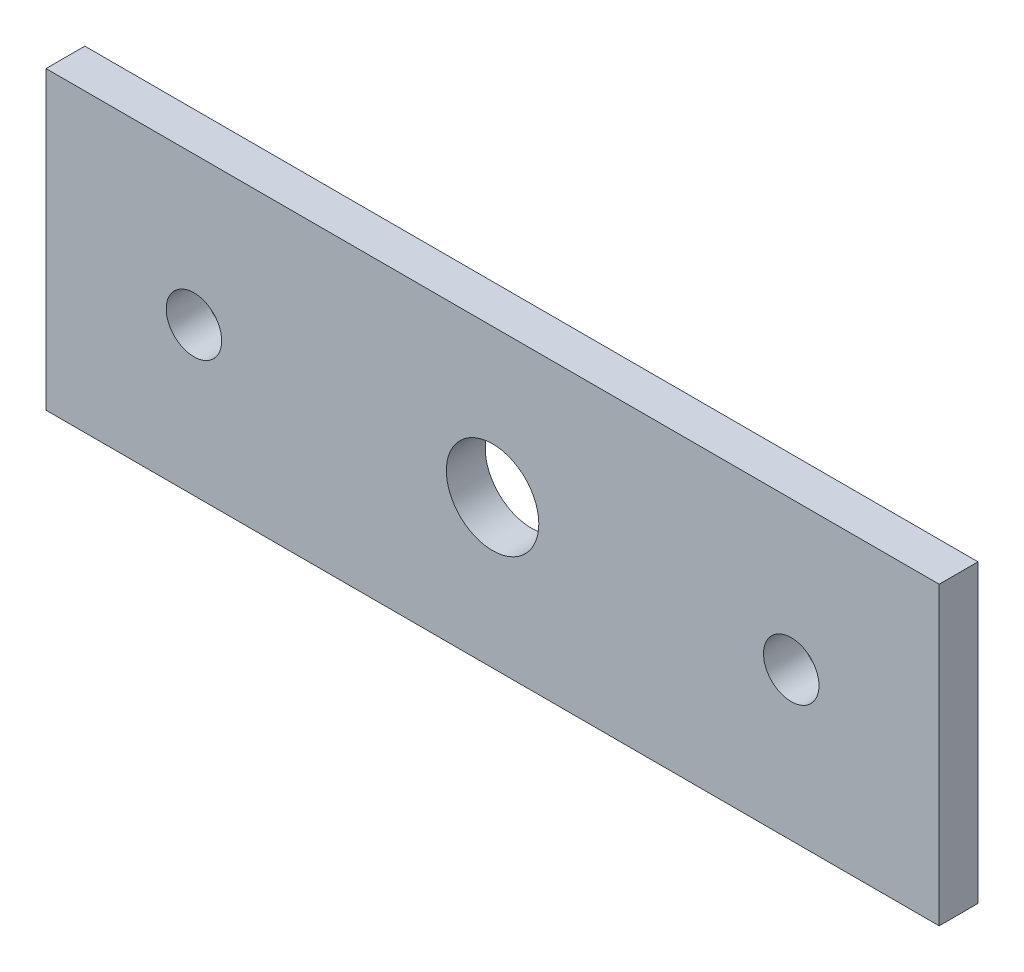
ISO-10303-21;
HEADER;
FILE_DESCRIPTION(('STEP AP214'),'2;1');
FILE_NAME('part.step','',(''),(''),'','','');
FILE_SCHEMA(('AUTOMOTIVE_DESIGN { 1 0 10303 214 1 1 1 1 }'));
ENDSEC;
DATA;
#1=APPLICATION_CONTEXT('core data for automotive mechanical design processes');
#2=APPLICATION_PROTOCOL_DEFINITION('international standard','automotive_design',2000,#1);
#3=PRODUCT_CONTEXT('',#1,'mechanical');
#4=PRODUCT('Part','Part','',(#3));
#5=PRODUCT_RELATED_PRODUCT_CATEGORY('part','',(#4));
#6=PRODUCT_DEFINITION_FORMATION('','',#4);
#7=PRODUCT_DEFINITION_CONTEXT('part definition',#1,'design');
#8=PRODUCT_DEFINITION('design','',#6,#7);
#9=PRODUCT_DEFINITION_SHAPE('','',#8);
#10=(LENGTH_UNIT() NAMED_UNIT(*) SI_UNIT(.MILLI.,.METRE.));
#11=(NAMED_UNIT(*) PLANE_ANGLE_UNIT() SI_UNIT($,.RADIAN.));
#12=(NAMED_UNIT(*) SI_UNIT($,.STERADIAN.) SOLID_ANGLE_UNIT());
#13=UNCERTAINTY_MEASURE_WITH_UNIT(LENGTH_MEASURE(1.E-05),#10,'distance_accuracy_value','');
#14=(GEOMETRIC_REPRESENTATION_CONTEXT(3) GLOBAL_UNCERTAINTY_ASSIGNED_CONTEXT((#13)) GLOBAL_UNIT_ASSIGNED_CONTEXT((#10,
#11,#12)) REPRESENTATION_CONTEXT('',''));
#15=CARTESIAN_POINT('',(0.,0.,0.));
#16=DIRECTION('',(0.,0.,1.));
#17=DIRECTION('',(1.,0.,0.));
#18=AXIS2_PLACEMENT_3D('',#15,#16,#17);
#19=CARTESIAN_POINT('',(-19.8824614450658,16.6713286713287,4.2));
#20=DIRECTION('',(1.,0.,0.));
#21=DIRECTION('',(0.,0.,-1.));
#22=AXIS2_PLACEMENT_3D('',#19,#20,#21);
#23=PLANE('',#22);
#24=DIRECTION('',(0.,-1.,0.));
#25=VECTOR('',#24,1.);
#26=CARTESIAN_POINT('',(-19.8824614450658,16.6713286713287,0.));
#27=LINE('',#26,#25);
#28=CARTESIAN_POINT('',(-19.8824614450658,16.6713286713287,0.));
#29=VERTEX_POINT('',#28);
#30=CARTESIAN_POINT('',(-19.8824614450658,-15.3286713286713,0.));
#31=VERTEX_POINT('',#30);
#32=EDGE_CURVE('E96',#29,#31,#27,.T.);
#33=ORIENTED_EDGE('',*,*,#32,.T.);
#34=DIRECTION('',(0.,0.,-1.));
#35=VECTOR('',#34,1.);
#36=CARTESIAN_POINT('',(-19.8824614450658,-15.3286713286713,4.2));
#37=LINE('',#36,#35);
#38=CARTESIAN_POINT('',(-19.8824614450658,-15.3286713286713,4.2));
#39=VERTEX_POINT('',#38);
#40=EDGE_CURVE('E11',#39,#31,#37,.T.);
#41=ORIENTED_EDGE('',*,*,#40,.F.);
#42=DIRECTION('',(0.,-1.,0.));
#43=VECTOR('',#42,1.);
#44=CARTESIAN_POINT('',(-19.8824614450658,16.6713286713287,4.2));
#45=LINE('',#44,#43);
#46=CARTESIAN_POINT('',(-19.8824614450658,16.6713286713287,4.2));
#47=VERTEX_POINT('',#46);
#48=EDGE_CURVE('E84',#47,#39,#45,.T.);
#49=ORIENTED_EDGE('',*,*,#48,.F.);
#50=DIRECTION('',(0.,0.,-1.));
#51=VECTOR('',#50,1.);
#52=CARTESIAN_POINT('',(-19.8824614450658,16.6713286713287,4.2));
#53=LINE('',#52,#51);
#54=EDGE_CURVE('E92',#47,#29,#53,.T.);
#55=ORIENTED_EDGE('',*,*,#54,.T.);
#56=EDGE_LOOP('',(#33,#41,#49,#55));
#57=FACE_BOUND('',#56,.T.);
#58=ADVANCED_FACE('F33',(#57),#23,.F.);
#59=CARTESIAN_POINT('',(-19.8824614450658,-15.3286713286713,4.2));
#60=DIRECTION('',(0.,1.,0.));
#61=DIRECTION('',(-1.,0.,0.));
#62=AXIS2_PLACEMENT_3D('',#59,#60,#61);
#63=PLANE('',#62);
#64=DIRECTION('',(1.,0.,0.));
#65=VECTOR('',#64,1.);
#66=CARTESIAN_POINT('',(-19.8824614450658,-15.3286713286713,0.));
#67=LINE('',#66,#65);
#68=CARTESIAN_POINT('',(76.7175385549342,-15.3286713286713,0.));
#69=VERTEX_POINT('',#68);
#70=EDGE_CURVE('E88',#31,#69,#67,.T.);
#71=ORIENTED_EDGE('',*,*,#70,.T.);
#72=DIRECTION('',(0.,0.,-1.));
#73=VECTOR('',#72,1.);
#74=CARTESIAN_POINT('',(76.7175385549342,-15.3286713286713,4.2));
#75=LINE('',#74,#73);
#76=CARTESIAN_POINT('',(76.7175385549342,-15.3286713286713,4.2));
#77=VERTEX_POINT('',#76);
#78=EDGE_CURVE('E41',#77,#69,#75,.T.);
#79=ORIENTED_EDGE('',*,*,#78,.F.);
#80=DIRECTION('',(1.,0.,0.));
#81=VECTOR('',#80,1.);
#82=CARTESIAN_POINT('',(-19.8824614450658,-15.3286713286713,4.2));
#83=LINE('',#82,#81);
#84=EDGE_CURVE('E79',#39,#77,#83,.T.);
#85=ORIENTED_EDGE('',*,*,#84,.F.);
#86=ORIENTED_EDGE('',*,*,#40,.T.);
#87=EDGE_LOOP('',(#71,#79,#85,#86));
#88=FACE_BOUND('',#87,.T.);
#89=ADVANCED_FACE('F87',(#88),#63,.F.);
#90=CARTESIAN_POINT('',(76.7175385549342,16.6713286713287,4.2));
#91=DIRECTION('',(-1.,0.,0.));
#92=DIRECTION('',(0.,0.,1.));
#93=AXIS2_PLACEMENT_3D('',#90,#91,#92);
#94=PLANE('',#93);
#95=DIRECTION('',(0.,1.,0.));
#96=VECTOR('',#95,1.);
#97=CARTESIAN_POINT('',(76.7175385549342,16.6713286713287,0.));
#98=LINE('',#97,#96);
#99=CARTESIAN_POINT('',(76.7175385549342,16.6713286713287,0.));
#100=VERTEX_POINT('',#99);
#101=EDGE_CURVE('E66',#69,#100,#98,.T.);
#102=ORIENTED_EDGE('',*,*,#101,.T.);
#103=DIRECTION('',(0.,0.,-1.));
#104=VECTOR('',#103,1.);
#105=CARTESIAN_POINT('',(76.7175385549342,16.6713286713287,4.2));
#106=LINE('',#105,#104);
#107=CARTESIAN_POINT('',(76.7175385549342,16.6713286713287,4.2));
#108=VERTEX_POINT('',#107);
#109=EDGE_CURVE('E89',#108,#100,#106,.T.);
#110=ORIENTED_EDGE('',*,*,#109,.F.);
#111=DIRECTION('',(0.,1.,0.));
#112=VECTOR('',#111,1.);
#113=CARTESIAN_POINT('',(76.7175385549342,16.6713286713287,4.2));
#114=LINE('',#113,#112);
#115=EDGE_CURVE('E82',#77,#108,#114,.T.);
#116=ORIENTED_EDGE('',*,*,#115,.F.);
#117=ORIENTED_EDGE('',*,*,#78,.T.);
#118=EDGE_LOOP('',(#102,#110,#116,#117));
#119=FACE_BOUND('',#118,.T.);
#120=ADVANCED_FACE('F90',(#119),#94,.F.);
#121=CARTESIAN_POINT('',(-19.8824614450658,16.6713286713287,4.2));
#122=DIRECTION('',(0.,-1.,0.));
#123=DIRECTION('',(0.,0.,-1.));
#124=AXIS2_PLACEMENT_3D('',#121,#122,#123);
#125=PLANE('',#124);
#126=DIRECTION('',(-1.,0.,0.));
#127=VECTOR('',#126,1.);
#128=CARTESIAN_POINT('',(-19.8824614450658,16.6713286713287,0.));
#129=LINE('',#128,#127);
#130=EDGE_CURVE('E72',#100,#29,#129,.T.);
#131=ORIENTED_EDGE('',*,*,#130,.T.);
#132=ORIENTED_EDGE('',*,*,#54,.F.);
#133=DIRECTION('',(-1.,0.,0.));
#134=VECTOR('',#133,1.);
#135=CARTESIAN_POINT('',(-19.8824614450658,16.6713286713287,4.2));
#136=LINE('',#135,#134);
#137=EDGE_CURVE('E49',#108,#47,#136,.T.);
#138=ORIENTED_EDGE('',*,*,#137,.F.);
#139=ORIENTED_EDGE('',*,*,#109,.T.);
#140=EDGE_LOOP('',(#131,#132,#138,#139));
#141=FACE_BOUND('',#140,.T.);
#142=ADVANCED_FACE('F104',(#141),#125,.F.);
#143=CARTESIAN_POINT('',(0.,0.,4.2));
#144=DIRECTION('',(0.,0.,1.));
#145=DIRECTION('',(1.,0.,0.));
#146=AXIS2_PLACEMENT_3D('',#143,#144,#145);
#147=PLANE('',#146);
#148=CARTESIAN_POINT('',(-3.8824614450658,0.671328671328672,4.2));
#149=DIRECTION('',(0.,0.,1.));
#150=DIRECTION('',(1.,0.,0.));
#151=AXIS2_PLACEMENT_3D('',#148,#149,#150);
#152=CIRCLE('',#151,3.);
#153=CARTESIAN_POINT('',(-0.882461445065796,0.671328671328672,4.2));
#154=VERTEX_POINT('',#153);
#155=EDGE_CURVE('E122',#154,#154,#152,.T.);
#156=ORIENTED_EDGE('',*,*,#155,.F.);
#157=EDGE_LOOP('',(#156));
#158=FACE_BOUND('',#157,.T.);
#159=CARTESIAN_POINT('',(60.7175385549342,0.671328671328672,4.2));
#160=DIRECTION('',(0.,0.,1.));
#161=DIRECTION('',(1.,0.,0.));
#162=AXIS2_PLACEMENT_3D('',#159,#160,#161);
#163=CIRCLE('',#162,3.00000000000001);
#164=CARTESIAN_POINT('',(63.7175385549342,0.671328671328672,4.2));
#165=VERTEX_POINT('',#164);
#166=EDGE_CURVE('E116',#165,#165,#163,.T.);
#167=ORIENTED_EDGE('',*,*,#166,.F.);
#168=EDGE_LOOP('',(#167));
#169=FACE_BOUND('',#168,.T.);
#170=CARTESIAN_POINT('',(28.4175385549342,0.671328671328673,4.2));
#171=DIRECTION('',(0.,0.,1.));
#172=DIRECTION('',(1.,0.,0.));
#173=AXIS2_PLACEMENT_3D('',#170,#171,#172);
#174=CIRCLE('',#173,4.99999999999999);
#175=CARTESIAN_POINT('',(33.4175385549342,0.671328671328673,4.2));
#176=VERTEX_POINT('',#175);
#177=EDGE_CURVE('E110',#176,#176,#174,.T.);
#178=ORIENTED_EDGE('',*,*,#177,.F.);
#179=EDGE_LOOP('',(#178));
#180=FACE_BOUND('',#179,.T.);
#181=ORIENTED_EDGE('',*,*,#48,.T.);
#182=ORIENTED_EDGE('',*,*,#84,.T.);
#183=ORIENTED_EDGE('',*,*,#115,.T.);
#184=ORIENTED_EDGE('',*,*,#137,.T.);
#185=EDGE_LOOP('',(#181,#182,#183,#184));
#186=FACE_BOUND('',#185,.T.);
#187=ADVANCED_FACE('F80',(#158,#169,#180,#186),#147,.T.);
#188=CARTESIAN_POINT('',(0.,0.,0.));
#189=DIRECTION('',(0.,0.,1.));
#190=DIRECTION('',(1.,0.,0.));
#191=AXIS2_PLACEMENT_3D('',#188,#189,#190);
#192=PLANE('',#191);
#193=CARTESIAN_POINT('',(-3.8824614450658,0.671328671328672,0.));
#194=DIRECTION('',(0.,0.,1.));
#195=DIRECTION('',(1.,0.,0.));
#196=AXIS2_PLACEMENT_3D('',#193,#194,#195);
#197=CIRCLE('',#196,3.);
#198=CARTESIAN_POINT('',(-0.882461445065796,0.671328671328672,0.));
#199=VERTEX_POINT('',#198);
#200=EDGE_CURVE('E99',#199,#199,#197,.T.);
#201=ORIENTED_EDGE('',*,*,#200,.T.);
#202=EDGE_LOOP('',(#201));
#203=FACE_BOUND('',#202,.T.);
#204=CARTESIAN_POINT('',(60.7175385549342,0.671328671328672,0.));
#205=DIRECTION('',(0.,0.,1.));
#206=DIRECTION('',(1.,0.,0.));
#207=AXIS2_PLACEMENT_3D('',#204,#205,#206);
#208=CIRCLE('',#207,3.00000000000001);
#209=CARTESIAN_POINT('',(63.7175385549342,0.671328671328672,0.));
#210=VERTEX_POINT('',#209);
#211=EDGE_CURVE('E119',#210,#210,#208,.T.);
#212=ORIENTED_EDGE('',*,*,#211,.T.);
#213=EDGE_LOOP('',(#212));
#214=FACE_BOUND('',#213,.T.);
#215=CARTESIAN_POINT('',(28.4175385549342,0.671328671328673,0.));
#216=DIRECTION('',(0.,0.,1.));
#217=DIRECTION('',(1.,0.,0.));
#218=AXIS2_PLACEMENT_3D('',#215,#216,#217);
#219=CIRCLE('',#218,4.99999999999999);
#220=CARTESIAN_POINT('',(33.4175385549342,0.671328671328673,0.));
#221=VERTEX_POINT('',#220);
#222=EDGE_CURVE('E113',#221,#221,#219,.T.);
#223=ORIENTED_EDGE('',*,*,#222,.T.);
#224=EDGE_LOOP('',(#223));
#225=FACE_BOUND('',#224,.T.);
#226=ORIENTED_EDGE('',*,*,#32,.F.);
#227=ORIENTED_EDGE('',*,*,#130,.F.);
#228=ORIENTED_EDGE('',*,*,#101,.F.);
#229=ORIENTED_EDGE('',*,*,#70,.F.);
#230=EDGE_LOOP('',(#226,#227,#228,#229));
#231=FACE_BOUND('',#230,.T.);
#232=ADVANCED_FACE('F107',(#203,#214,#225,#231),#192,.F.);
#233=CARTESIAN_POINT('',(28.4175385549342,0.671328671328673,0.));
#234=DIRECTION('',(0.,0.,1.));
#235=DIRECTION('',(1.,0.,0.));
#236=AXIS2_PLACEMENT_3D('',#233,#234,#235);
#237=CYLINDRICAL_SURFACE('',#236,4.99999999999999);
#238=ORIENTED_EDGE('',*,*,#222,.F.);
#239=EDGE_LOOP('',(#238));
#240=FACE_BOUND('',#239,.T.);
#241=ORIENTED_EDGE('',*,*,#177,.T.);
#242=EDGE_LOOP('',(#241));
#243=FACE_BOUND('',#242,.T.);
#244=ADVANCED_FACE('F144',(#240,#243),#237,.F.);
#245=CARTESIAN_POINT('',(60.7175385549342,0.671328671328672,0.));
#246=DIRECTION('',(0.,0.,1.));
#247=DIRECTION('',(1.,0.,0.));
#248=AXIS2_PLACEMENT_3D('',#245,#246,#247);
#249=CYLINDRICAL_SURFACE('',#248,3.00000000000001);
#250=ORIENTED_EDGE('',*,*,#211,.F.);
#251=EDGE_LOOP('',(#250));
#252=FACE_BOUND('',#251,.T.);
#253=ORIENTED_EDGE('',*,*,#166,.T.);
#254=EDGE_LOOP('',(#253));
#255=FACE_BOUND('',#254,.T.);
#256=ADVANCED_FACE('F133',(#252,#255),#249,.F.);
#257=CARTESIAN_POINT('',(-3.8824614450658,0.671328671328672,0.));
#258=DIRECTION('',(0.,0.,1.));
#259=DIRECTION('',(1.,0.,0.));
#260=AXIS2_PLACEMENT_3D('',#257,#258,#259);
#261=CYLINDRICAL_SURFACE('',#260,3.);
#262=ORIENTED_EDGE('',*,*,#200,.F.);
#263=EDGE_LOOP('',(#262));
#264=FACE_BOUND('',#263,.T.);
#265=ORIENTED_EDGE('',*,*,#155,.T.);
#266=EDGE_LOOP('',(#265));
#267=FACE_BOUND('',#266,.T.);
#268=ADVANCED_FACE('F130',(#264,#267),#261,.F.);
#269=CLOSED_SHELL('',(#58,#89,#120,#142,#187,#232,#244,#256,#268));
#270=MANIFOLD_SOLID_BREP('B2',#269);
#271=ADVANCED_BREP_SHAPE_REPRESENTATION('',(#18,#270),#14);
#272=SHAPE_DEFINITION_REPRESENTATION(#9,#271);
ENDSEC;
END-ISO-10303-21;
